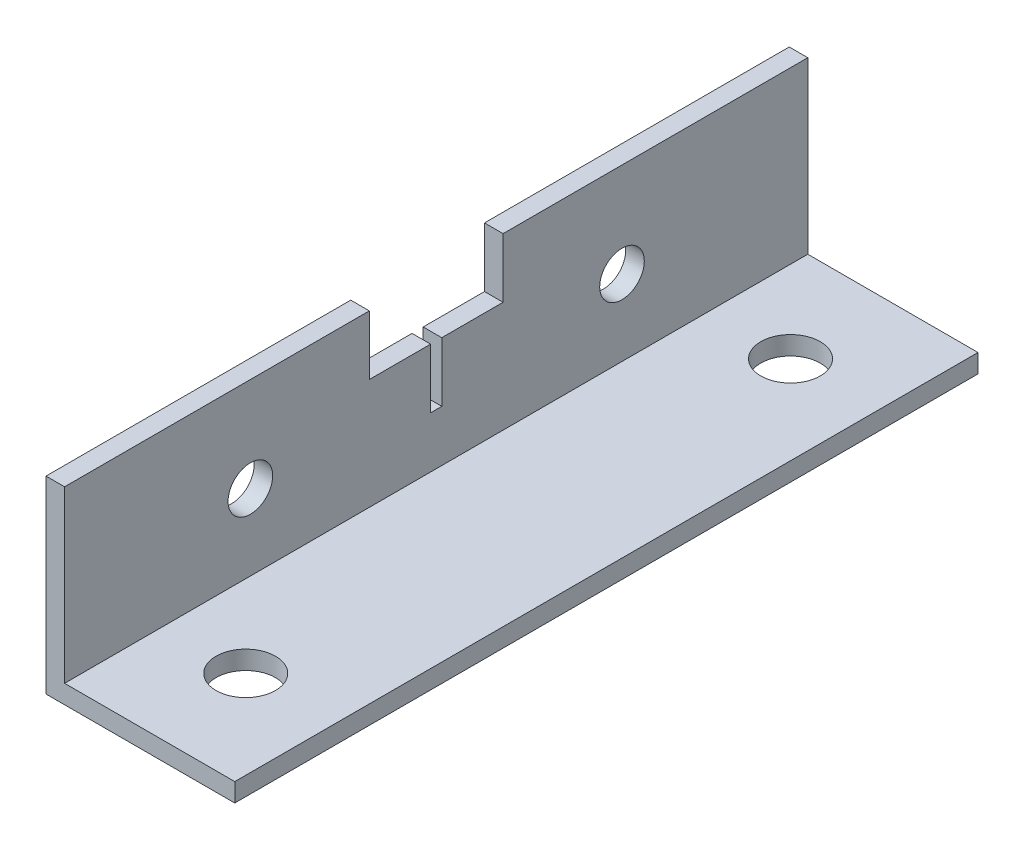
ISO-10303-21;
HEADER;
FILE_DESCRIPTION(('STEP AP214'),'2;1');
FILE_NAME('part.step','',(''),(''),'','','');
FILE_SCHEMA(('AUTOMOTIVE_DESIGN { 1 0 10303 214 1 1 1 1 }'));
ENDSEC;
DATA;
#1=APPLICATION_CONTEXT('core data for automotive mechanical design processes');
#2=APPLICATION_PROTOCOL_DEFINITION('international standard','automotive_design',2000,#1);
#3=PRODUCT_CONTEXT('',#1,'mechanical');
#4=PRODUCT('Part','Part','',(#3));
#5=PRODUCT_RELATED_PRODUCT_CATEGORY('part','',(#4));
#6=PRODUCT_DEFINITION_FORMATION('','',#4);
#7=PRODUCT_DEFINITION_CONTEXT('part definition',#1,'design');
#8=PRODUCT_DEFINITION('design','',#6,#7);
#9=PRODUCT_DEFINITION_SHAPE('','',#8);
#10=(LENGTH_UNIT() NAMED_UNIT(*) SI_UNIT(.MILLI.,.METRE.));
#11=(NAMED_UNIT(*) PLANE_ANGLE_UNIT() SI_UNIT($,.RADIAN.));
#12=(NAMED_UNIT(*) SI_UNIT($,.STERADIAN.) SOLID_ANGLE_UNIT());
#13=UNCERTAINTY_MEASURE_WITH_UNIT(LENGTH_MEASURE(1.E-05),#10,'distance_accuracy_value','');
#14=(GEOMETRIC_REPRESENTATION_CONTEXT(3) GLOBAL_UNCERTAINTY_ASSIGNED_CONTEXT((#13)) GLOBAL_UNIT_ASSIGNED_CONTEXT((#10,
#11,#12)) REPRESENTATION_CONTEXT('',''));
#15=CARTESIAN_POINT('',(0.,0.,0.));
#16=DIRECTION('',(0.,0.,1.));
#17=DIRECTION('',(1.,0.,0.));
#18=AXIS2_PLACEMENT_3D('',#15,#16,#17);
#19=CARTESIAN_POINT('',(0.,25.4,50.));
#20=DIRECTION('',(0.,1.,0.));
#21=DIRECTION('',(0.,0.,1.));
#22=AXIS2_PLACEMENT_3D('',#19,#20,#21);
#23=PLANE('',#22);
#24=DIRECTION('',(-1.,0.,0.));
#25=VECTOR('',#24,1.);
#26=CARTESIAN_POINT('',(25.4,25.4,9.));
#27=LINE('',#26,#25);
#28=CARTESIAN_POINT('',(2.5,25.4,9.));
#29=VERTEX_POINT('',#28);
#30=CARTESIAN_POINT('',(0.,25.4,9.));
#31=VERTEX_POINT('',#30);
#32=EDGE_CURVE('E187',#29,#31,#27,.T.);
#33=ORIENTED_EDGE('',*,*,#32,.T.);
#34=DIRECTION('',(0.,0.,-1.));
#35=VECTOR('',#34,1.);
#36=CARTESIAN_POINT('',(0.,25.4,50.));
#37=LINE('',#36,#35);
#38=CARTESIAN_POINT('',(0.,25.4,50.));
#39=VERTEX_POINT('',#38);
#40=EDGE_CURVE('E125',#39,#31,#37,.T.);
#41=ORIENTED_EDGE('',*,*,#40,.F.);
#42=DIRECTION('',(1.,0.,0.));
#43=VECTOR('',#42,1.);
#44=CARTESIAN_POINT('',(0.,25.4,50.));
#45=LINE('',#44,#43);
#46=CARTESIAN_POINT('',(2.5,25.4,50.));
#47=VERTEX_POINT('',#46);
#48=EDGE_CURVE('E120',#39,#47,#45,.T.);
#49=ORIENTED_EDGE('',*,*,#48,.T.);
#50=DIRECTION('',(0.,0.,-1.));
#51=VECTOR('',#50,1.);
#52=CARTESIAN_POINT('',(2.5,25.4,50.));
#53=LINE('',#52,#51);
#54=EDGE_CURVE('E105',#47,#29,#53,.T.);
#55=ORIENTED_EDGE('',*,*,#54,.T.);
#56=EDGE_LOOP('',(#33,#41,#49,#55));
#57=FACE_BOUND('',#56,.T.);
#58=ADVANCED_FACE('F35',(#57),#23,.T.);
#59=CARTESIAN_POINT('',(0.,0.,50.));
#60=DIRECTION('',(0.,1.,0.));
#61=DIRECTION('',(0.,0.,1.));
#62=AXIS2_PLACEMENT_3D('',#59,#60,#61);
#63=PLANE('',#62);
#64=CARTESIAN_POINT('',(13.525,0.,-36.65));
#65=DIRECTION('',(0.,-1.,0.));
#66=DIRECTION('',(0.,0.,-1.));
#67=AXIS2_PLACEMENT_3D('',#64,#65,#66);
#68=CIRCLE('',#67,4.00000000000001);
#69=CARTESIAN_POINT('',(13.525,0.,-40.65));
#70=VERTEX_POINT('',#69);
#71=EDGE_CURVE('E324',#70,#70,#68,.T.);
#72=ORIENTED_EDGE('',*,*,#71,.F.);
#73=EDGE_LOOP('',(#72));
#74=FACE_BOUND('',#73,.T.);
#75=CARTESIAN_POINT('',(13.525,0.,36.65));
#76=DIRECTION('',(0.,-1.,0.));
#77=DIRECTION('',(0.,0.,-1.));
#78=AXIS2_PLACEMENT_3D('',#75,#76,#77);
#79=CIRCLE('',#78,4.00000000000001);
#80=CARTESIAN_POINT('',(13.525,0.,32.65));
#81=VERTEX_POINT('',#80);
#82=EDGE_CURVE('E235',#81,#81,#79,.T.);
#83=ORIENTED_EDGE('',*,*,#82,.F.);
#84=EDGE_LOOP('',(#83));
#85=FACE_BOUND('',#84,.T.);
#86=DIRECTION('',(1.,0.,0.));
#87=VECTOR('',#86,1.);
#88=CARTESIAN_POINT('',(0.,0.,-50.));
#89=LINE('',#88,#87);
#90=CARTESIAN_POINT('',(0.,0.,-50.));
#91=VERTEX_POINT('',#90);
#92=CARTESIAN_POINT('',(25.4,0.,-50.));
#93=VERTEX_POINT('',#92);
#94=EDGE_CURVE('E131',#91,#93,#89,.T.);
#95=ORIENTED_EDGE('',*,*,#94,.T.);
#96=DIRECTION('',(0.,0.,-1.));
#97=VECTOR('',#96,1.);
#98=CARTESIAN_POINT('',(25.4,0.,50.));
#99=LINE('',#98,#97);
#100=CARTESIAN_POINT('',(25.4,0.,50.));
#101=VERTEX_POINT('',#100);
#102=EDGE_CURVE('E11',#101,#93,#99,.T.);
#103=ORIENTED_EDGE('',*,*,#102,.F.);
#104=DIRECTION('',(1.,0.,0.));
#105=VECTOR('',#104,1.);
#106=CARTESIAN_POINT('',(0.,0.,50.));
#107=LINE('',#106,#105);
#108=CARTESIAN_POINT('',(0.,0.,50.));
#109=VERTEX_POINT('',#108);
#110=EDGE_CURVE('E91',#109,#101,#107,.T.);
#111=ORIENTED_EDGE('',*,*,#110,.F.);
#112=DIRECTION('',(0.,0.,-1.));
#113=VECTOR('',#112,1.);
#114=CARTESIAN_POINT('',(0.,0.,50.));
#115=LINE('',#114,#113);
#116=EDGE_CURVE('E127',#109,#91,#115,.T.);
#117=ORIENTED_EDGE('',*,*,#116,.T.);
#118=EDGE_LOOP('',(#95,#103,#111,#117));
#119=FACE_BOUND('',#118,.T.);
#120=ADVANCED_FACE('F37',(#74,#85,#119),#63,.F.);
#121=CARTESIAN_POINT('',(25.4,2.5,50.));
#122=DIRECTION('',(1.,0.,0.));
#123=DIRECTION('',(0.,0.,-1.));
#124=AXIS2_PLACEMENT_3D('',#121,#122,#123);
#125=PLANE('',#124);
#126=DIRECTION('',(0.,-1.,0.));
#127=VECTOR('',#126,1.);
#128=CARTESIAN_POINT('',(25.4,2.5,-50.));
#129=LINE('',#128,#127);
#130=CARTESIAN_POINT('',(25.4,2.5,-50.));
#131=VERTEX_POINT('',#130);
#132=EDGE_CURVE('E134',#131,#93,#129,.T.);
#133=ORIENTED_EDGE('',*,*,#132,.F.);
#134=DIRECTION('',(0.,0.,-1.));
#135=VECTOR('',#134,1.);
#136=CARTESIAN_POINT('',(25.4,2.5,50.));
#137=LINE('',#136,#135);
#138=CARTESIAN_POINT('',(25.4,2.5,50.));
#139=VERTEX_POINT('',#138);
#140=EDGE_CURVE('E43',#139,#131,#137,.T.);
#141=ORIENTED_EDGE('',*,*,#140,.F.);
#142=DIRECTION('',(0.,-1.,0.));
#143=VECTOR('',#142,1.);
#144=CARTESIAN_POINT('',(25.4,2.5,50.));
#145=LINE('',#144,#143);
#146=EDGE_CURVE('E209',#139,#101,#145,.T.);
#147=ORIENTED_EDGE('',*,*,#146,.T.);
#148=ORIENTED_EDGE('',*,*,#102,.T.);
#149=EDGE_LOOP('',(#133,#141,#147,#148));
#150=FACE_BOUND('',#149,.T.);
#151=ADVANCED_FACE('F157',(#150),#125,.T.);
#152=CARTESIAN_POINT('',(0.,2.5,50.));
#153=DIRECTION('',(0.,1.,0.));
#154=DIRECTION('',(0.,0.,1.));
#155=AXIS2_PLACEMENT_3D('',#152,#153,#154);
#156=PLANE('',#155);
#157=CARTESIAN_POINT('',(13.525,2.5,-36.65));
#158=DIRECTION('',(0.,1.,0.));
#159=DIRECTION('',(0.,0.,1.));
#160=AXIS2_PLACEMENT_3D('',#157,#158,#159);
#161=CIRCLE('',#160,4.00000000000001);
#162=CARTESIAN_POINT('',(13.525,2.5,-32.65));
#163=VERTEX_POINT('',#162);
#164=EDGE_CURVE('E330',#163,#163,#161,.F.);
#165=ORIENTED_EDGE('',*,*,#164,.T.);
#166=EDGE_LOOP('',(#165));
#167=FACE_BOUND('',#166,.T.);
#168=CARTESIAN_POINT('',(13.525,2.5,36.65));
#169=DIRECTION('',(0.,1.,0.));
#170=DIRECTION('',(0.,0.,1.));
#171=AXIS2_PLACEMENT_3D('',#168,#169,#170);
#172=CIRCLE('',#171,4.00000000000001);
#173=CARTESIAN_POINT('',(13.525,2.5,40.65));
#174=VERTEX_POINT('',#173);
#175=EDGE_CURVE('E238',#174,#174,#172,.F.);
#176=ORIENTED_EDGE('',*,*,#175,.T.);
#177=EDGE_LOOP('',(#176));
#178=FACE_BOUND('',#177,.T.);
#179=DIRECTION('',(1.,0.,0.));
#180=VECTOR('',#179,1.);
#181=CARTESIAN_POINT('',(0.,2.5,-50.));
#182=LINE('',#181,#180);
#183=CARTESIAN_POINT('',(2.5,2.5,-50.));
#184=VERTEX_POINT('',#183);
#185=EDGE_CURVE('E138',#184,#131,#182,.T.);
#186=ORIENTED_EDGE('',*,*,#185,.F.);
#187=DIRECTION('',(0.,0.,-1.));
#188=VECTOR('',#187,1.);
#189=CARTESIAN_POINT('',(2.5,2.5,50.));
#190=LINE('',#189,#188);
#191=CARTESIAN_POINT('',(2.5,2.5,50.));
#192=VERTEX_POINT('',#191);
#193=EDGE_CURVE('E115',#192,#184,#190,.T.);
#194=ORIENTED_EDGE('',*,*,#193,.F.);
#195=DIRECTION('',(1.,0.,0.));
#196=VECTOR('',#195,1.);
#197=CARTESIAN_POINT('',(0.,2.5,50.));
#198=LINE('',#197,#196);
#199=EDGE_CURVE('E122',#192,#139,#198,.T.);
#200=ORIENTED_EDGE('',*,*,#199,.T.);
#201=ORIENTED_EDGE('',*,*,#140,.T.);
#202=EDGE_LOOP('',(#186,#194,#200,#201));
#203=FACE_BOUND('',#202,.T.);
#204=ADVANCED_FACE('F154',(#167,#178,#203),#156,.T.);
#205=CARTESIAN_POINT('',(2.5,0.,50.));
#206=DIRECTION('',(1.,0.,0.));
#207=DIRECTION('',(0.,0.,-1.));
#208=AXIS2_PLACEMENT_3D('',#205,#206,#207);
#209=PLANE('',#208);
#210=CARTESIAN_POINT('',(2.5,12.7,25.));
#211=DIRECTION('',(1.,0.,0.));
#212=DIRECTION('',(0.,0.,-1.));
#213=AXIS2_PLACEMENT_3D('',#210,#211,#212);
#214=CIRCLE('',#213,3.);
#215=CARTESIAN_POINT('',(2.5,12.7,22.));
#216=VERTEX_POINT('',#215);
#217=EDGE_CURVE('E135',#216,#216,#214,.T.);
#218=ORIENTED_EDGE('',*,*,#217,.F.);
#219=EDGE_LOOP('',(#218));
#220=FACE_BOUND('',#219,.T.);
#221=CARTESIAN_POINT('',(2.5,12.7,-25.));
#222=DIRECTION('',(1.,0.,0.));
#223=DIRECTION('',(0.,0.,-1.));
#224=AXIS2_PLACEMENT_3D('',#221,#222,#223);
#225=CIRCLE('',#224,3.);
#226=CARTESIAN_POINT('',(2.5,12.7,-28.));
#227=VERTEX_POINT('',#226);
#228=EDGE_CURVE('E203',#227,#227,#225,.T.);
#229=ORIENTED_EDGE('',*,*,#228,.F.);
#230=EDGE_LOOP('',(#229));
#231=FACE_BOUND('',#230,.T.);
#232=DIRECTION('',(0.,-1.,0.));
#233=VECTOR('',#232,1.);
#234=CARTESIAN_POINT('',(2.5,0.,8.99999999999999));
#235=LINE('',#234,#233);
#236=CARTESIAN_POINT('',(2.5,17.4,9.));
#237=VERTEX_POINT('',#236);
#238=EDGE_CURVE('E111',#29,#237,#235,.T.);
#239=ORIENTED_EDGE('',*,*,#238,.F.);
#240=ORIENTED_EDGE('',*,*,#54,.F.);
#241=DIRECTION('',(0.,1.,0.));
#242=VECTOR('',#241,1.);
#243=CARTESIAN_POINT('',(2.5,0.,50.));
#244=LINE('',#243,#242);
#245=EDGE_CURVE('E108',#47,#192,#244,.F.);
#246=ORIENTED_EDGE('',*,*,#245,.T.);
#247=ORIENTED_EDGE('',*,*,#193,.T.);
#248=DIRECTION('',(0.,1.,0.));
#249=VECTOR('',#248,1.);
#250=CARTESIAN_POINT('',(2.5,0.,-50.));
#251=LINE('',#250,#249);
#252=CARTESIAN_POINT('',(2.5,25.4,-50.));
#253=VERTEX_POINT('',#252);
#254=EDGE_CURVE('E141',#253,#184,#251,.F.);
#255=ORIENTED_EDGE('',*,*,#254,.F.);
#256=CARTESIAN_POINT('',(2.5,25.4,-9.));
#257=VERTEX_POINT('',#256);
#258=EDGE_CURVE('E116',#257,#253,#53,.T.);
#259=ORIENTED_EDGE('',*,*,#258,.F.);
#260=DIRECTION('',(0.,1.,0.));
#261=VECTOR('',#260,1.);
#262=CARTESIAN_POINT('',(2.5,0.,-8.99999999999999));
#263=LINE('',#262,#261);
#264=CARTESIAN_POINT('',(2.5,17.4,-9.));
#265=VERTEX_POINT('',#264);
#266=EDGE_CURVE('E168',#265,#257,#263,.T.);
#267=ORIENTED_EDGE('',*,*,#266,.F.);
#268=DIRECTION('',(0.,0.,-1.));
#269=VECTOR('',#268,1.);
#270=CARTESIAN_POINT('',(2.5,17.4,50.));
#271=LINE('',#270,#269);
#272=CARTESIAN_POINT('',(2.5,17.4,-0.75));
#273=VERTEX_POINT('',#272);
#274=EDGE_CURVE('E186',#273,#265,#271,.T.);
#275=ORIENTED_EDGE('',*,*,#274,.F.);
#276=DIRECTION('',(0.,1.,0.));
#277=VECTOR('',#276,1.);
#278=CARTESIAN_POINT('',(2.5,0.,-0.750000000000001));
#279=LINE('',#278,#277);
#280=CARTESIAN_POINT('',(2.5,9.39999999999999,-0.749999999999999));
#281=VERTEX_POINT('',#280);
#282=EDGE_CURVE('E190',#281,#273,#279,.T.);
#283=ORIENTED_EDGE('',*,*,#282,.F.);
#284=DIRECTION('',(0.,0.,-1.));
#285=VECTOR('',#284,1.);
#286=CARTESIAN_POINT('',(2.5,9.39999999999999,50.));
#287=LINE('',#286,#285);
#288=CARTESIAN_POINT('',(2.5,9.39999999999999,0.749999999999999));
#289=VERTEX_POINT('',#288);
#290=EDGE_CURVE('E193',#289,#281,#287,.T.);
#291=ORIENTED_EDGE('',*,*,#290,.F.);
#292=DIRECTION('',(0.,-1.,0.));
#293=VECTOR('',#292,1.);
#294=CARTESIAN_POINT('',(2.5,0.,0.750000000000001));
#295=LINE('',#294,#293);
#296=CARTESIAN_POINT('',(2.5,17.4,0.75));
#297=VERTEX_POINT('',#296);
#298=EDGE_CURVE('E196',#297,#289,#295,.T.);
#299=ORIENTED_EDGE('',*,*,#298,.F.);
#300=DIRECTION('',(0.,0.,-1.));
#301=VECTOR('',#300,1.);
#302=CARTESIAN_POINT('',(2.5,17.4,50.));
#303=LINE('',#302,#301);
#304=EDGE_CURVE('E199',#237,#297,#303,.T.);
#305=ORIENTED_EDGE('',*,*,#304,.F.);
#306=EDGE_LOOP('',(#239,#240,#246,#247,#255,#259,#267,#275,#283,#291,#299,#305));
#307=FACE_BOUND('',#306,.T.);
#308=ADVANCED_FACE('F107',(#220,#231,#307),#209,.T.);
#309=DIRECTION('',(-1.,0.,0.));
#310=VECTOR('',#309,1.);
#311=CARTESIAN_POINT('',(25.4,25.4,-9.));
#312=LINE('',#311,#310);
#313=CARTESIAN_POINT('',(0.,25.4,-8.99999999999999));
#314=VERTEX_POINT('',#313);
#315=EDGE_CURVE('E50',#257,#314,#312,.T.);
#316=ORIENTED_EDGE('',*,*,#315,.F.);
#317=ORIENTED_EDGE('',*,*,#258,.T.);
#318=DIRECTION('',(1.,0.,0.));
#319=VECTOR('',#318,1.);
#320=CARTESIAN_POINT('',(0.,25.4,-50.));
#321=LINE('',#320,#319);
#322=CARTESIAN_POINT('',(0.,25.4,-50.));
#323=VERTEX_POINT('',#322);
#324=EDGE_CURVE('E144',#323,#253,#321,.T.);
#325=ORIENTED_EDGE('',*,*,#324,.F.);
#326=EDGE_CURVE('E149',#314,#323,#37,.T.);
#327=ORIENTED_EDGE('',*,*,#326,.F.);
#328=EDGE_LOOP('',(#316,#317,#325,#327));
#329=FACE_BOUND('',#328,.T.);
#330=ADVANCED_FACE('F172',(#329),#23,.T.);
#331=CARTESIAN_POINT('',(0.,0.,50.));
#332=DIRECTION('',(1.,0.,0.));
#333=DIRECTION('',(0.,0.,-1.));
#334=AXIS2_PLACEMENT_3D('',#331,#332,#333);
#335=PLANE('',#334);
#336=CARTESIAN_POINT('',(0.,12.7,25.));
#337=DIRECTION('',(-1.,0.,0.));
#338=DIRECTION('',(0.,0.,1.));
#339=AXIS2_PLACEMENT_3D('',#336,#337,#338);
#340=CIRCLE('',#339,3.);
#341=CARTESIAN_POINT('',(0.,12.7,28.));
#342=VERTEX_POINT('',#341);
#343=EDGE_CURVE('E230',#342,#342,#340,.T.);
#344=ORIENTED_EDGE('',*,*,#343,.F.);
#345=EDGE_LOOP('',(#344));
#346=FACE_BOUND('',#345,.T.);
#347=CARTESIAN_POINT('',(0.,12.7,-25.));
#348=DIRECTION('',(-1.,0.,0.));
#349=DIRECTION('',(0.,0.,1.));
#350=AXIS2_PLACEMENT_3D('',#347,#348,#349);
#351=CIRCLE('',#350,3.);
#352=CARTESIAN_POINT('',(0.,12.7,-22.));
#353=VERTEX_POINT('',#352);
#354=EDGE_CURVE('E227',#353,#353,#351,.T.);
#355=ORIENTED_EDGE('',*,*,#354,.F.);
#356=EDGE_LOOP('',(#355));
#357=FACE_BOUND('',#356,.T.);
#358=ORIENTED_EDGE('',*,*,#40,.T.);
#359=DIRECTION('',(0.,1.,0.));
#360=VECTOR('',#359,1.);
#361=CARTESIAN_POINT('',(0.,25.4,9.));
#362=LINE('',#361,#360);
#363=CARTESIAN_POINT('',(0.,17.4,9.));
#364=VERTEX_POINT('',#363);
#365=EDGE_CURVE('E175',#364,#31,#362,.T.);
#366=ORIENTED_EDGE('',*,*,#365,.F.);
#367=DIRECTION('',(0.,0.,1.));
#368=VECTOR('',#367,1.);
#369=CARTESIAN_POINT('',(0.,17.4,9.));
#370=LINE('',#369,#368);
#371=CARTESIAN_POINT('',(0.,17.4,0.75));
#372=VERTEX_POINT('',#371);
#373=EDGE_CURVE('E181',#372,#364,#370,.T.);
#374=ORIENTED_EDGE('',*,*,#373,.F.);
#375=DIRECTION('',(0.,1.,0.));
#376=VECTOR('',#375,1.);
#377=CARTESIAN_POINT('',(0.,17.4,0.75));
#378=LINE('',#377,#376);
#379=CARTESIAN_POINT('',(0.,9.39999999999999,0.749999999999999));
#380=VERTEX_POINT('',#379);
#381=EDGE_CURVE('E249',#380,#372,#378,.T.);
#382=ORIENTED_EDGE('',*,*,#381,.F.);
#383=DIRECTION('',(0.,0.,1.));
#384=VECTOR('',#383,1.);
#385=CARTESIAN_POINT('',(0.,9.39999999999999,-0.749999999999999));
#386=LINE('',#385,#384);
#387=CARTESIAN_POINT('',(0.,9.39999999999999,-0.749999999999999));
#388=VERTEX_POINT('',#387);
#389=EDGE_CURVE('E246',#388,#380,#386,.T.);
#390=ORIENTED_EDGE('',*,*,#389,.F.);
#391=DIRECTION('',(0.,-1.,0.));
#392=VECTOR('',#391,1.);
#393=CARTESIAN_POINT('',(0.,17.4,-0.75));
#394=LINE('',#393,#392);
#395=CARTESIAN_POINT('',(0.,17.4,-0.75));
#396=VERTEX_POINT('',#395);
#397=EDGE_CURVE('E243',#396,#388,#394,.T.);
#398=ORIENTED_EDGE('',*,*,#397,.F.);
#399=DIRECTION('',(0.,0.,1.));
#400=VECTOR('',#399,1.);
#401=CARTESIAN_POINT('',(0.,17.4,-9.));
#402=LINE('',#401,#400);
#403=CARTESIAN_POINT('',(0.,17.4,-9.));
#404=VERTEX_POINT('',#403);
#405=EDGE_CURVE('E232',#404,#396,#402,.T.);
#406=ORIENTED_EDGE('',*,*,#405,.F.);
#407=DIRECTION('',(0.,-1.,0.));
#408=VECTOR('',#407,1.);
#409=CARTESIAN_POINT('',(0.,25.4,-9.));
#410=LINE('',#409,#408);
#411=EDGE_CURVE('E229',#314,#404,#410,.T.);
#412=ORIENTED_EDGE('',*,*,#411,.F.);
#413=ORIENTED_EDGE('',*,*,#326,.T.);
#414=DIRECTION('',(0.,-1.,0.));
#415=VECTOR('',#414,1.);
#416=CARTESIAN_POINT('',(0.,0.,-50.));
#417=LINE('',#416,#415);
#418=EDGE_CURVE('E85',#323,#91,#417,.T.);
#419=ORIENTED_EDGE('',*,*,#418,.T.);
#420=ORIENTED_EDGE('',*,*,#116,.F.);
#421=DIRECTION('',(0.,-1.,0.));
#422=VECTOR('',#421,1.);
#423=CARTESIAN_POINT('',(0.,0.,50.));
#424=LINE('',#423,#422);
#425=EDGE_CURVE('E59',#39,#109,#424,.T.);
#426=ORIENTED_EDGE('',*,*,#425,.F.);
#427=EDGE_LOOP('',(#358,#366,#374,#382,#390,#398,#406,#412,#413,#419,#420,#426));
#428=FACE_BOUND('',#427,.T.);
#429=ADVANCED_FACE('F283',(#346,#357,#428),#335,.F.);
#430=CARTESIAN_POINT('',(0.,0.,50.));
#431=DIRECTION('',(0.,0.,-1.));
#432=DIRECTION('',(-1.,0.,0.));
#433=AXIS2_PLACEMENT_3D('',#430,#431,#432);
#434=PLANE('',#433);
#435=ORIENTED_EDGE('',*,*,#110,.T.);
#436=ORIENTED_EDGE('',*,*,#146,.F.);
#437=ORIENTED_EDGE('',*,*,#199,.F.);
#438=ORIENTED_EDGE('',*,*,#245,.F.);
#439=ORIENTED_EDGE('',*,*,#48,.F.);
#440=ORIENTED_EDGE('',*,*,#425,.T.);
#441=EDGE_LOOP('',(#435,#436,#437,#438,#439,#440));
#442=FACE_BOUND('',#441,.T.);
#443=ADVANCED_FACE('F119',(#442),#434,.F.);
#444=CARTESIAN_POINT('',(0.,0.,-50.));
#445=DIRECTION('',(0.,0.,-1.));
#446=DIRECTION('',(-1.,0.,0.));
#447=AXIS2_PLACEMENT_3D('',#444,#445,#446);
#448=PLANE('',#447);
#449=ORIENTED_EDGE('',*,*,#94,.F.);
#450=ORIENTED_EDGE('',*,*,#418,.F.);
#451=ORIENTED_EDGE('',*,*,#324,.T.);
#452=ORIENTED_EDGE('',*,*,#254,.T.);
#453=ORIENTED_EDGE('',*,*,#185,.T.);
#454=ORIENTED_EDGE('',*,*,#132,.T.);
#455=EDGE_LOOP('',(#449,#450,#451,#452,#453,#454));
#456=FACE_BOUND('',#455,.T.);
#457=ADVANCED_FACE('F160',(#456),#448,.T.);
#458=CARTESIAN_POINT('',(25.4,25.4,9.));
#459=DIRECTION('',(0.,0.,1.));
#460=DIRECTION('',(0.,-1.,0.));
#461=AXIS2_PLACEMENT_3D('',#458,#459,#460);
#462=PLANE('',#461);
#463=ORIENTED_EDGE('',*,*,#238,.T.);
#464=DIRECTION('',(-1.,0.,0.));
#465=VECTOR('',#464,1.);
#466=CARTESIAN_POINT('',(25.4,17.4,9.));
#467=LINE('',#466,#465);
#468=EDGE_CURVE('E255',#237,#364,#467,.T.);
#469=ORIENTED_EDGE('',*,*,#468,.T.);
#470=ORIENTED_EDGE('',*,*,#365,.T.);
#471=ORIENTED_EDGE('',*,*,#32,.F.);
#472=EDGE_LOOP('',(#463,#469,#470,#471));
#473=FACE_BOUND('',#472,.T.);
#474=ADVANCED_FACE('F311',(#473),#462,.F.);
#475=CARTESIAN_POINT('',(25.4,17.4,9.));
#476=DIRECTION('',(0.,-1.,0.));
#477=DIRECTION('',(0.,0.,-1.));
#478=AXIS2_PLACEMENT_3D('',#475,#476,#477);
#479=PLANE('',#478);
#480=ORIENTED_EDGE('',*,*,#304,.T.);
#481=DIRECTION('',(-1.,0.,0.));
#482=VECTOR('',#481,1.);
#483=CARTESIAN_POINT('',(25.4,17.4,0.75));
#484=LINE('',#483,#482);
#485=EDGE_CURVE('E258',#297,#372,#484,.T.);
#486=ORIENTED_EDGE('',*,*,#485,.T.);
#487=ORIENTED_EDGE('',*,*,#373,.T.);
#488=ORIENTED_EDGE('',*,*,#468,.F.);
#489=EDGE_LOOP('',(#480,#486,#487,#488));
#490=FACE_BOUND('',#489,.T.);
#491=ADVANCED_FACE('F350',(#490),#479,.F.);
#492=CARTESIAN_POINT('',(25.4,17.4,0.75));
#493=DIRECTION('',(0.,0.,1.));
#494=DIRECTION('',(0.,-1.,0.));
#495=AXIS2_PLACEMENT_3D('',#492,#493,#494);
#496=PLANE('',#495);
#497=ORIENTED_EDGE('',*,*,#298,.T.);
#498=DIRECTION('',(-1.,0.,0.));
#499=VECTOR('',#498,1.);
#500=CARTESIAN_POINT('',(25.4,9.39999999999999,0.749999999999999));
#501=LINE('',#500,#499);
#502=EDGE_CURVE('E261',#289,#380,#501,.T.);
#503=ORIENTED_EDGE('',*,*,#502,.T.);
#504=ORIENTED_EDGE('',*,*,#381,.T.);
#505=ORIENTED_EDGE('',*,*,#485,.F.);
#506=EDGE_LOOP('',(#497,#503,#504,#505));
#507=FACE_BOUND('',#506,.T.);
#508=ADVANCED_FACE('F353',(#507),#496,.F.);
#509=CARTESIAN_POINT('',(25.4,9.39999999999999,-0.749999999999999));
#510=DIRECTION('',(0.,-1.,0.));
#511=DIRECTION('',(0.,0.,-1.));
#512=AXIS2_PLACEMENT_3D('',#509,#510,#511);
#513=PLANE('',#512);
#514=ORIENTED_EDGE('',*,*,#290,.T.);
#515=DIRECTION('',(-1.,0.,0.));
#516=VECTOR('',#515,1.);
#517=CARTESIAN_POINT('',(25.4,9.39999999999999,-0.749999999999999));
#518=LINE('',#517,#516);
#519=EDGE_CURVE('E264',#281,#388,#518,.T.);
#520=ORIENTED_EDGE('',*,*,#519,.T.);
#521=ORIENTED_EDGE('',*,*,#389,.T.);
#522=ORIENTED_EDGE('',*,*,#502,.F.);
#523=EDGE_LOOP('',(#514,#520,#521,#522));
#524=FACE_BOUND('',#523,.T.);
#525=ADVANCED_FACE('F290',(#524),#513,.F.);
#526=CARTESIAN_POINT('',(25.4,17.4,-0.75));
#527=DIRECTION('',(0.,0.,-1.));
#528=DIRECTION('',(0.,1.,0.));
#529=AXIS2_PLACEMENT_3D('',#526,#527,#528);
#530=PLANE('',#529);
#531=ORIENTED_EDGE('',*,*,#282,.T.);
#532=DIRECTION('',(-1.,0.,0.));
#533=VECTOR('',#532,1.);
#534=CARTESIAN_POINT('',(25.4,17.4,-0.75));
#535=LINE('',#534,#533);
#536=EDGE_CURVE('E178',#273,#396,#535,.T.);
#537=ORIENTED_EDGE('',*,*,#536,.T.);
#538=ORIENTED_EDGE('',*,*,#397,.T.);
#539=ORIENTED_EDGE('',*,*,#519,.F.);
#540=EDGE_LOOP('',(#531,#537,#538,#539));
#541=FACE_BOUND('',#540,.T.);
#542=ADVANCED_FACE('F270',(#541),#530,.F.);
#543=CARTESIAN_POINT('',(25.4,17.4,-9.));
#544=DIRECTION('',(0.,-1.,0.));
#545=DIRECTION('',(0.,0.,-1.));
#546=AXIS2_PLACEMENT_3D('',#543,#544,#545);
#547=PLANE('',#546);
#548=ORIENTED_EDGE('',*,*,#274,.T.);
#549=DIRECTION('',(-1.,0.,0.));
#550=VECTOR('',#549,1.);
#551=CARTESIAN_POINT('',(25.4,17.4,-9.));
#552=LINE('',#551,#550);
#553=EDGE_CURVE('E174',#265,#404,#552,.T.);
#554=ORIENTED_EDGE('',*,*,#553,.T.);
#555=ORIENTED_EDGE('',*,*,#405,.T.);
#556=ORIENTED_EDGE('',*,*,#536,.F.);
#557=EDGE_LOOP('',(#548,#554,#555,#556));
#558=FACE_BOUND('',#557,.T.);
#559=ADVANCED_FACE('F281',(#558),#547,.F.);
#560=CARTESIAN_POINT('',(25.4,25.4,-9.));
#561=DIRECTION('',(0.,0.,-1.));
#562=DIRECTION('',(0.,1.,0.));
#563=AXIS2_PLACEMENT_3D('',#560,#561,#562);
#564=PLANE('',#563);
#565=ORIENTED_EDGE('',*,*,#266,.T.);
#566=ORIENTED_EDGE('',*,*,#315,.T.);
#567=ORIENTED_EDGE('',*,*,#411,.T.);
#568=ORIENTED_EDGE('',*,*,#553,.F.);
#569=EDGE_LOOP('',(#565,#566,#567,#568));
#570=FACE_BOUND('',#569,.T.);
#571=ADVANCED_FACE('F223',(#570),#564,.F.);
#572=CARTESIAN_POINT('',(25.4,12.7,-25.));
#573=DIRECTION('',(-1.,0.,0.));
#574=DIRECTION('',(0.,0.,1.));
#575=AXIS2_PLACEMENT_3D('',#572,#573,#574);
#576=CYLINDRICAL_SURFACE('',#575,3.);
#577=ORIENTED_EDGE('',*,*,#228,.T.);
#578=EDGE_LOOP('',(#577));
#579=FACE_BOUND('',#578,.T.);
#580=ORIENTED_EDGE('',*,*,#354,.T.);
#581=EDGE_LOOP('',(#580));
#582=FACE_BOUND('',#581,.T.);
#583=ADVANCED_FACE('F220',(#579,#582),#576,.F.);
#584=CARTESIAN_POINT('',(25.4,12.7,25.));
#585=DIRECTION('',(-1.,0.,0.));
#586=DIRECTION('',(0.,0.,1.));
#587=AXIS2_PLACEMENT_3D('',#584,#585,#586);
#588=CYLINDRICAL_SURFACE('',#587,3.);
#589=ORIENTED_EDGE('',*,*,#217,.T.);
#590=EDGE_LOOP('',(#589));
#591=FACE_BOUND('',#590,.T.);
#592=ORIENTED_EDGE('',*,*,#343,.T.);
#593=EDGE_LOOP('',(#592));
#594=FACE_BOUND('',#593,.T.);
#595=ADVANCED_FACE('F212',(#591,#594),#588,.F.);
#596=CARTESIAN_POINT('',(13.525,25.401,36.65));
#597=DIRECTION('',(0.,-1.,0.));
#598=DIRECTION('',(0.,0.,-1.));
#599=AXIS2_PLACEMENT_3D('',#596,#597,#598);
#600=CYLINDRICAL_SURFACE('',#599,4.00000000000001);
#601=ORIENTED_EDGE('',*,*,#175,.F.);
#602=EDGE_LOOP('',(#601));
#603=FACE_BOUND('',#602,.T.);
#604=ORIENTED_EDGE('',*,*,#82,.T.);
#605=EDGE_LOOP('',(#604));
#606=FACE_BOUND('',#605,.T.);
#607=ADVANCED_FACE('F336',(#603,#606),#600,.F.);
#608=CARTESIAN_POINT('',(13.525,25.401,-36.65));
#609=DIRECTION('',(0.,-1.,0.));
#610=DIRECTION('',(0.,0.,-1.));
#611=AXIS2_PLACEMENT_3D('',#608,#609,#610);
#612=CYLINDRICAL_SURFACE('',#611,4.00000000000001);
#613=ORIENTED_EDGE('',*,*,#164,.F.);
#614=EDGE_LOOP('',(#613));
#615=FACE_BOUND('',#614,.T.);
#616=ORIENTED_EDGE('',*,*,#71,.T.);
#617=EDGE_LOOP('',(#616));
#618=FACE_BOUND('',#617,.T.);
#619=ADVANCED_FACE('F334',(#615,#618),#612,.F.);
#620=CLOSED_SHELL('',(#58,#120,#151,#204,#308,#330,#429,#443,#457,#474,#491,#508,#525,#542,#559,
#571,#583,#595,#607,#619));
#621=MANIFOLD_SOLID_BREP('B2',#620);
#622=ADVANCED_BREP_SHAPE_REPRESENTATION('',(#18,#621),#14);
#623=SHAPE_DEFINITION_REPRESENTATION(#9,#622);
ENDSEC;
END-ISO-10303-21;
